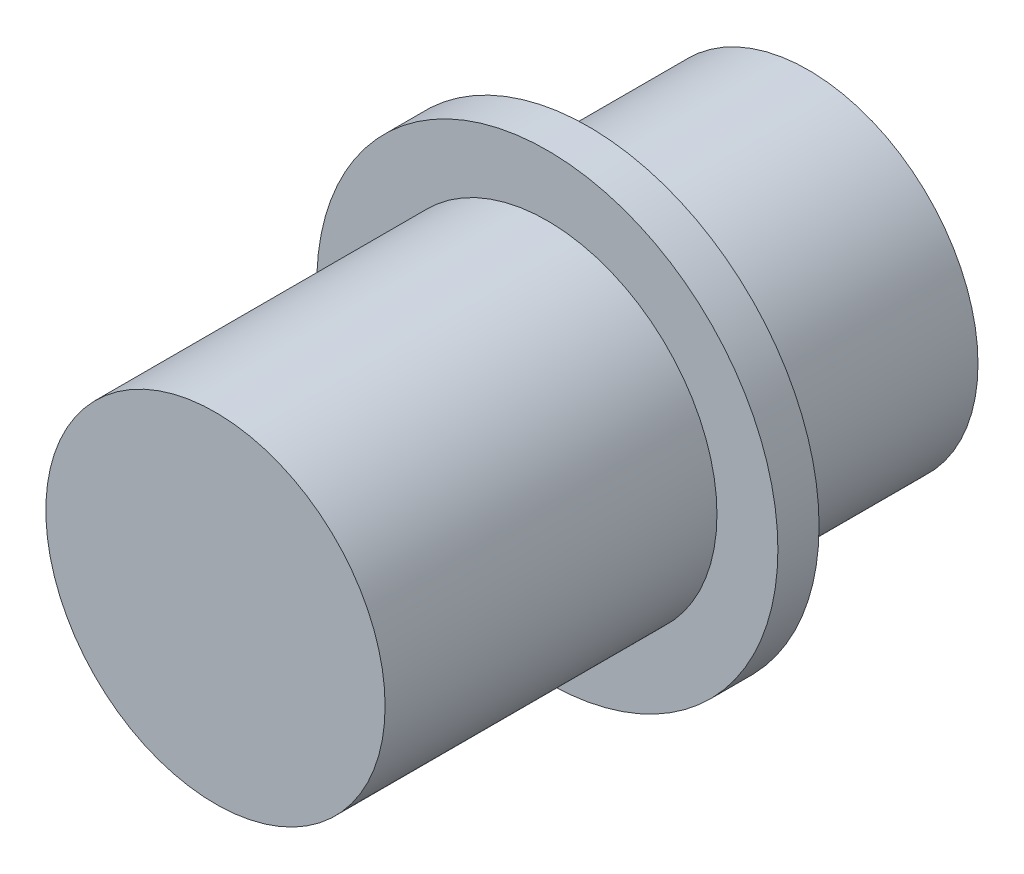
ISO-10303-21;
HEADER;
FILE_DESCRIPTION(('STEP AP214'),'2;1');
FILE_NAME('part.step','',(''),(''),'','','');
FILE_SCHEMA(('AUTOMOTIVE_DESIGN { 1 0 10303 214 1 1 1 1 }'));
ENDSEC;
DATA;
#1=APPLICATION_CONTEXT('core data for automotive mechanical design processes');
#2=APPLICATION_PROTOCOL_DEFINITION('international standard','automotive_design',2000,#1);
#3=PRODUCT_CONTEXT('',#1,'mechanical');
#4=PRODUCT('Part','Part','',(#3));
#5=PRODUCT_RELATED_PRODUCT_CATEGORY('part','',(#4));
#6=PRODUCT_DEFINITION_FORMATION('','',#4);
#7=PRODUCT_DEFINITION_CONTEXT('part definition',#1,'design');
#8=PRODUCT_DEFINITION('design','',#6,#7);
#9=PRODUCT_DEFINITION_SHAPE('','',#8);
#10=(LENGTH_UNIT() NAMED_UNIT(*) SI_UNIT(.MILLI.,.METRE.));
#11=(NAMED_UNIT(*) PLANE_ANGLE_UNIT() SI_UNIT($,.RADIAN.));
#12=(NAMED_UNIT(*) SI_UNIT($,.STERADIAN.) SOLID_ANGLE_UNIT());
#13=UNCERTAINTY_MEASURE_WITH_UNIT(LENGTH_MEASURE(1.E-05),#10,'distance_accuracy_value','');
#14=(GEOMETRIC_REPRESENTATION_CONTEXT(3) GLOBAL_UNCERTAINTY_ASSIGNED_CONTEXT((#13)) GLOBAL_UNIT_ASSIGNED_CONTEXT((#10,
#11,#12)) REPRESENTATION_CONTEXT('',''));
#15=CARTESIAN_POINT('',(0.,0.,0.));
#16=DIRECTION('',(0.,0.,1.));
#17=DIRECTION('',(1.,0.,0.));
#18=AXIS2_PLACEMENT_3D('',#15,#16,#17);
#19=CARTESIAN_POINT('',(0.,0.,20.15));
#20=DIRECTION('',(0.,0.,-1.));
#21=DIRECTION('',(-1.,0.,0.));
#22=AXIS2_PLACEMENT_3D('',#19,#20,#21);
#23=CYLINDRICAL_SURFACE('',#22,10.3);
#24=CARTESIAN_POINT('',(0.,0.,20.15));
#25=DIRECTION('',(0.,0.,1.));
#26=DIRECTION('',(1.,0.,0.));
#27=AXIS2_PLACEMENT_3D('',#24,#25,#26);
#28=CIRCLE('',#27,10.3);
#29=CARTESIAN_POINT('',(10.3,0.,20.15));
#30=VERTEX_POINT('',#29);
#31=EDGE_CURVE('E10',#30,#30,#28,.T.);
#32=ORIENTED_EDGE('',*,*,#31,.F.);
#33=EDGE_LOOP('',(#32));
#34=FACE_BOUND('',#33,.T.);
#35=CARTESIAN_POINT('',(0.,0.,0.));
#36=DIRECTION('',(0.,0.,1.));
#37=DIRECTION('',(1.,0.,0.));
#38=AXIS2_PLACEMENT_3D('',#35,#36,#37);
#39=CIRCLE('',#38,10.3);
#40=CARTESIAN_POINT('',(10.3,0.,0.));
#41=VERTEX_POINT('',#40);
#42=EDGE_CURVE('E44',#41,#41,#39,.T.);
#43=ORIENTED_EDGE('',*,*,#42,.T.);
#44=EDGE_LOOP('',(#43));
#45=FACE_BOUND('',#44,.T.);
#46=ADVANCED_FACE('F41',(#34,#45),#23,.T.);
#47=CARTESIAN_POINT('',(0.,0.,20.15));
#48=DIRECTION('',(0.,0.,1.));
#49=DIRECTION('',(1.,0.,0.));
#50=AXIS2_PLACEMENT_3D('',#47,#48,#49);
#51=PLANE('',#50);
#52=ORIENTED_EDGE('',*,*,#31,.T.);
#53=EDGE_LOOP('',(#52));
#54=FACE_BOUND('',#53,.T.);
#55=ADVANCED_FACE('F83',(#54),#51,.T.);
#56=CARTESIAN_POINT('',(0.,0.,-2.5));
#57=DIRECTION('',(0.,0.,1.));
#58=DIRECTION('',(1.,0.,0.));
#59=AXIS2_PLACEMENT_3D('',#56,#57,#58);
#60=CYLINDRICAL_SURFACE('',#59,14.);
#61=CARTESIAN_POINT('',(0.,0.,-2.5));
#62=DIRECTION('',(0.,0.,1.));
#63=DIRECTION('',(1.,0.,0.));
#64=AXIS2_PLACEMENT_3D('',#61,#62,#63);
#65=CIRCLE('',#64,14.);
#66=CARTESIAN_POINT('',(14.,0.,-2.5));
#67=VERTEX_POINT('',#66);
#68=EDGE_CURVE('E53',#67,#67,#65,.T.);
#69=ORIENTED_EDGE('',*,*,#68,.T.);
#70=EDGE_LOOP('',(#69));
#71=FACE_BOUND('',#70,.T.);
#72=CARTESIAN_POINT('',(0.,0.,0.));
#73=DIRECTION('',(0.,0.,1.));
#74=DIRECTION('',(1.,0.,0.));
#75=AXIS2_PLACEMENT_3D('',#72,#73,#74);
#76=CIRCLE('',#75,14.);
#77=CARTESIAN_POINT('',(14.,0.,0.));
#78=VERTEX_POINT('',#77);
#79=EDGE_CURVE('E55',#78,#78,#76,.T.);
#80=ORIENTED_EDGE('',*,*,#79,.F.);
#81=EDGE_LOOP('',(#80));
#82=FACE_BOUND('',#81,.T.);
#83=ADVANCED_FACE('F88',(#71,#82),#60,.T.);
#84=CARTESIAN_POINT('',(0.,0.,-2.5));
#85=DIRECTION('',(0.,0.,1.));
#86=DIRECTION('',(1.,0.,0.));
#87=AXIS2_PLACEMENT_3D('',#84,#85,#86);
#88=PLANE('',#87);
#89=CARTESIAN_POINT('',(0.,0.,-2.5));
#90=DIRECTION('',(0.,0.,1.));
#91=DIRECTION('',(1.,0.,0.));
#92=AXIS2_PLACEMENT_3D('',#89,#90,#91);
#93=CIRCLE('',#92,10.3);
#94=CARTESIAN_POINT('',(10.3,0.,-2.5));
#95=VERTEX_POINT('',#94);
#96=EDGE_CURVE('E59',#95,#95,#93,.T.);
#97=ORIENTED_EDGE('',*,*,#96,.T.);
#98=EDGE_LOOP('',(#97));
#99=FACE_BOUND('',#98,.T.);
#100=ORIENTED_EDGE('',*,*,#68,.F.);
#101=EDGE_LOOP('',(#100));
#102=FACE_BOUND('',#101,.T.);
#103=ADVANCED_FACE('F94',(#99,#102),#88,.F.);
#104=CARTESIAN_POINT('',(0.,0.,0.));
#105=DIRECTION('',(0.,0.,1.));
#106=DIRECTION('',(1.,0.,0.));
#107=AXIS2_PLACEMENT_3D('',#104,#105,#106);
#108=PLANE('',#107);
#109=ORIENTED_EDGE('',*,*,#42,.F.);
#110=EDGE_LOOP('',(#109));
#111=FACE_BOUND('',#110,.T.);
#112=ORIENTED_EDGE('',*,*,#79,.T.);
#113=EDGE_LOOP('',(#112));
#114=FACE_BOUND('',#113,.T.);
#115=ADVANCED_FACE('F80',(#111,#114),#108,.T.);
#116=CARTESIAN_POINT('',(0.,0.,-15.85));
#117=DIRECTION('',(0.,0.,1.));
#118=DIRECTION('',(1.,0.,0.));
#119=AXIS2_PLACEMENT_3D('',#116,#117,#118);
#120=CYLINDRICAL_SURFACE('',#119,10.3);
#121=CARTESIAN_POINT('',(0.,0.,-15.85));
#122=DIRECTION('',(0.,0.,1.));
#123=DIRECTION('',(1.,0.,0.));
#124=AXIS2_PLACEMENT_3D('',#121,#122,#123);
#125=CIRCLE('',#124,10.3);
#126=CARTESIAN_POINT('',(10.3,0.,-15.85));
#127=VERTEX_POINT('',#126);
#128=EDGE_CURVE('E66',#127,#127,#125,.T.);
#129=ORIENTED_EDGE('',*,*,#128,.T.);
#130=EDGE_LOOP('',(#129));
#131=FACE_BOUND('',#130,.T.);
#132=ORIENTED_EDGE('',*,*,#96,.F.);
#133=EDGE_LOOP('',(#132));
#134=FACE_BOUND('',#133,.T.);
#135=ADVANCED_FACE('F71',(#131,#134),#120,.T.);
#136=CARTESIAN_POINT('',(0.,0.,-15.85));
#137=DIRECTION('',(0.,0.,1.));
#138=DIRECTION('',(1.,0.,0.));
#139=AXIS2_PLACEMENT_3D('',#136,#137,#138);
#140=PLANE('',#139);
#141=ORIENTED_EDGE('',*,*,#128,.F.);
#142=EDGE_LOOP('',(#141));
#143=FACE_BOUND('',#142,.T.);
#144=ADVANCED_FACE('F74',(#143),#140,.F.);
#145=CLOSED_SHELL('',(#46,#55,#83,#103,#115,#135,#144));
#146=MANIFOLD_SOLID_BREP('B2',#145);
#147=ADVANCED_BREP_SHAPE_REPRESENTATION('',(#18,#146),#14);
#148=SHAPE_DEFINITION_REPRESENTATION(#9,#147);
ENDSEC;
END-ISO-10303-21;
